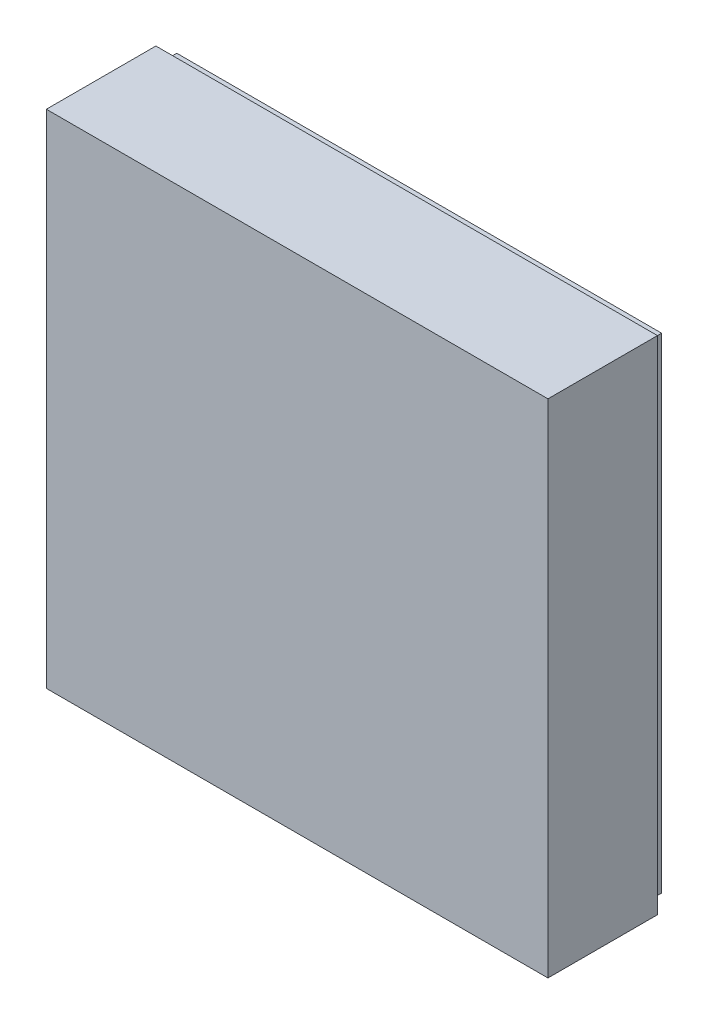
ISO-10303-21;
HEADER;
FILE_DESCRIPTION(('STEP AP214'),'2;1');
FILE_NAME('part.step','',(''),(''),'','','');
FILE_SCHEMA(('AUTOMOTIVE_DESIGN { 1 0 10303 214 1 1 1 1 }'));
ENDSEC;
DATA;
#1=APPLICATION_CONTEXT('core data for automotive mechanical design processes');
#2=APPLICATION_PROTOCOL_DEFINITION('international standard','automotive_design',2000,#1);
#3=PRODUCT_CONTEXT('',#1,'mechanical');
#4=PRODUCT('Part','Part','',(#3));
#5=PRODUCT_RELATED_PRODUCT_CATEGORY('part','',(#4));
#6=PRODUCT_DEFINITION_FORMATION('','',#4);
#7=PRODUCT_DEFINITION_CONTEXT('part definition',#1,'design');
#8=PRODUCT_DEFINITION('design','',#6,#7);
#9=PRODUCT_DEFINITION_SHAPE('','',#8);
#10=(LENGTH_UNIT() NAMED_UNIT(*) SI_UNIT(.MILLI.,.METRE.));
#11=(NAMED_UNIT(*) PLANE_ANGLE_UNIT() SI_UNIT($,.RADIAN.));
#12=(NAMED_UNIT(*) SI_UNIT($,.STERADIAN.) SOLID_ANGLE_UNIT());
#13=UNCERTAINTY_MEASURE_WITH_UNIT(LENGTH_MEASURE(1.E-05),#10,'distance_accuracy_value','');
#14=(GEOMETRIC_REPRESENTATION_CONTEXT(3) GLOBAL_UNCERTAINTY_ASSIGNED_CONTEXT((#13)) GLOBAL_UNIT_ASSIGNED_CONTEXT((#10,
#11,#12)) REPRESENTATION_CONTEXT('',''));
#15=CARTESIAN_POINT('',(0.,0.,0.));
#16=DIRECTION('',(0.,0.,1.));
#17=DIRECTION('',(1.,0.,0.));
#18=AXIS2_PLACEMENT_3D('',#15,#16,#17);
#19=CARTESIAN_POINT('',(1.75440540682,6.09062667297,6.613518376771));
#20=DIRECTION('',(0.,0.,1.));
#21=DIRECTION('',(1.,0.,0.));
#22=AXIS2_PLACEMENT_3D('',#19,#20,#21);
#23=PLANE('',#22);
#24=DIRECTION('',(0.,-1.,0.));
#25=VECTOR('',#24,1.);
#26=CARTESIAN_POINT('',(1.80440540682,6.04062667297,6.613518376771));
#27=LINE('',#26,#25);
#28=CARTESIAN_POINT('',(1.80440540682,6.04062667297,6.613518376771));
#29=VERTEX_POINT('',#28);
#30=CARTESIAN_POINT('',(1.80440540682,3.14062667297,6.613518376771));
#31=VERTEX_POINT('',#30);
#32=EDGE_CURVE('E93',#29,#31,#27,.T.);
#33=ORIENTED_EDGE('',*,*,#32,.F.);
#34=DIRECTION('',(1.,0.,0.));
#35=VECTOR('',#34,1.);
#36=CARTESIAN_POINT('',(4.70440540682,6.04062667297,6.613518376771));
#37=LINE('',#36,#35);
#38=CARTESIAN_POINT('',(4.70440540682,6.04062667297,6.613518376771));
#39=VERTEX_POINT('',#38);
#40=EDGE_CURVE('E81',#39,#29,#37,.F.);
#41=ORIENTED_EDGE('',*,*,#40,.F.);
#42=DIRECTION('',(0.,1.,0.));
#43=VECTOR('',#42,1.);
#44=CARTESIAN_POINT('',(4.70440540682,6.04062667297,6.613518376771));
#45=LINE('',#44,#43);
#46=CARTESIAN_POINT('',(4.70440540682,3.14062667297,6.613518376771));
#47=VERTEX_POINT('',#46);
#48=EDGE_CURVE('E108',#47,#39,#45,.T.);
#49=ORIENTED_EDGE('',*,*,#48,.F.);
#50=DIRECTION('',(1.,0.,0.));
#51=VECTOR('',#50,1.);
#52=CARTESIAN_POINT('',(4.70440540682,3.14062667297,6.613518376771));
#53=LINE('',#52,#51);
#54=EDGE_CURVE('E95',#31,#47,#53,.T.);
#55=ORIENTED_EDGE('',*,*,#54,.F.);
#56=EDGE_LOOP('',(#33,#41,#49,#55));
#57=FACE_BOUND('',#56,.T.);
#58=ADVANCED_FACE('F17',(#57),#23,.F.);
#59=CARTESIAN_POINT('',(1.80440540682,6.04062667297,6.688518376771));
#60=DIRECTION('',(-1.,0.,0.));
#61=DIRECTION('',(0.,-1.,0.));
#62=AXIS2_PLACEMENT_3D('',#59,#60,#61);
#63=PLANE('',#62);
#64=ORIENTED_EDGE('',*,*,#32,.T.);
#65=DIRECTION('',(0.,0.,-1.));
#66=VECTOR('',#65,1.);
#67=CARTESIAN_POINT('',(1.80440540682,3.14062667297,6.688518376771));
#68=LINE('',#67,#66);
#69=CARTESIAN_POINT('',(1.80440540682,3.14062667297,6.688518376771));
#70=VERTEX_POINT('',#69);
#71=EDGE_CURVE('E99',#70,#31,#68,.T.);
#72=ORIENTED_EDGE('',*,*,#71,.F.);
#73=DIRECTION('',(0.,1.,0.));
#74=VECTOR('',#73,1.);
#75=CARTESIAN_POINT('',(1.80440540682,6.09062667297,6.688518376771));
#76=LINE('',#75,#74);
#77=CARTESIAN_POINT('',(1.80440540682,6.04062667297,6.688518376771));
#78=VERTEX_POINT('',#77);
#79=EDGE_CURVE('E91',#78,#70,#76,.F.);
#80=ORIENTED_EDGE('',*,*,#79,.F.);
#81=DIRECTION('',(0.,0.,1.));
#82=VECTOR('',#81,1.);
#83=CARTESIAN_POINT('',(1.80440540682,6.04062667297,6.688518376771));
#84=LINE('',#83,#82);
#85=EDGE_CURVE('E86',#78,#29,#84,.F.);
#86=ORIENTED_EDGE('',*,*,#85,.T.);
#87=EDGE_LOOP('',(#64,#72,#80,#86));
#88=FACE_BOUND('',#87,.T.);
#89=ADVANCED_FACE('F102',(#88),#63,.T.);
#90=CARTESIAN_POINT('',(4.70440540682,3.14062667297,6.688518376771));
#91=DIRECTION('',(0.,-1.,0.));
#92=DIRECTION('',(0.,0.,-1.));
#93=AXIS2_PLACEMENT_3D('',#90,#91,#92);
#94=PLANE('',#93);
#95=ORIENTED_EDGE('',*,*,#54,.T.);
#96=DIRECTION('',(0.,0.,-1.));
#97=VECTOR('',#96,1.);
#98=CARTESIAN_POINT('',(4.70440540682,3.14062667297,6.688518376771));
#99=LINE('',#98,#97);
#100=CARTESIAN_POINT('',(4.70440540682,3.14062667297,6.688518376771));
#101=VERTEX_POINT('',#100);
#102=EDGE_CURVE('E110',#101,#47,#99,.T.);
#103=ORIENTED_EDGE('',*,*,#102,.F.);
#104=DIRECTION('',(-1.,0.,0.));
#105=VECTOR('',#104,1.);
#106=CARTESIAN_POINT('',(1.75440540682,3.14062667297,6.688518376771));
#107=LINE('',#106,#105);
#108=EDGE_CURVE('E125',#70,#101,#107,.F.);
#109=ORIENTED_EDGE('',*,*,#108,.F.);
#110=ORIENTED_EDGE('',*,*,#71,.T.);
#111=EDGE_LOOP('',(#95,#103,#109,#110));
#112=FACE_BOUND('',#111,.T.);
#113=ADVANCED_FACE('F123',(#112),#94,.T.);
#114=CARTESIAN_POINT('',(4.70440540682,6.04062667297,6.688518376771));
#115=DIRECTION('',(1.,0.,0.));
#116=DIRECTION('',(0.,0.,-1.));
#117=AXIS2_PLACEMENT_3D('',#114,#115,#116);
#118=PLANE('',#117);
#119=ORIENTED_EDGE('',*,*,#102,.T.);
#120=ORIENTED_EDGE('',*,*,#48,.T.);
#121=DIRECTION('',(0.,0.,1.));
#122=VECTOR('',#121,1.);
#123=CARTESIAN_POINT('',(4.70440540682,6.04062667297,6.688518376771));
#124=LINE('',#123,#122);
#125=CARTESIAN_POINT('',(4.70440540682,6.04062667297,6.688518376771));
#126=VERTEX_POINT('',#125);
#127=EDGE_CURVE('E88',#126,#39,#124,.F.);
#128=ORIENTED_EDGE('',*,*,#127,.F.);
#129=DIRECTION('',(0.,1.,0.));
#130=VECTOR('',#129,1.);
#131=CARTESIAN_POINT('',(4.70440540682,6.09062667297,6.688518376771));
#132=LINE('',#131,#130);
#133=EDGE_CURVE('E131',#101,#126,#132,.T.);
#134=ORIENTED_EDGE('',*,*,#133,.F.);
#135=EDGE_LOOP('',(#119,#120,#128,#134));
#136=FACE_BOUND('',#135,.T.);
#137=ADVANCED_FACE('F247',(#136),#118,.T.);
#138=CARTESIAN_POINT('',(4.70440540682,6.04062667297,6.688518376771));
#139=DIRECTION('',(0.,1.,0.));
#140=DIRECTION('',(0.,0.,1.));
#141=AXIS2_PLACEMENT_3D('',#138,#139,#140);
#142=PLANE('',#141);
#143=DIRECTION('',(-1.,0.,0.));
#144=VECTOR('',#143,1.);
#145=CARTESIAN_POINT('',(1.75440540682,6.04062667297,6.688518376771));
#146=LINE('',#145,#144);
#147=EDGE_CURVE('E129',#126,#78,#146,.T.);
#148=ORIENTED_EDGE('',*,*,#147,.F.);
#149=ORIENTED_EDGE('',*,*,#127,.T.);
#150=ORIENTED_EDGE('',*,*,#40,.T.);
#151=ORIENTED_EDGE('',*,*,#85,.F.);
#152=EDGE_LOOP('',(#148,#149,#150,#151));
#153=FACE_BOUND('',#152,.T.);
#154=ADVANCED_FACE('F84',(#153),#142,.T.);
#155=CARTESIAN_POINT('',(1.75440540682,6.09062667297,6.688518376771));
#156=DIRECTION('',(0.,0.,-1.));
#157=DIRECTION('',(-1.,0.,0.));
#158=AXIS2_PLACEMENT_3D('',#155,#156,#157);
#159=PLANE('',#158);
#160=ORIENTED_EDGE('',*,*,#147,.T.);
#161=ORIENTED_EDGE('',*,*,#79,.T.);
#162=ORIENTED_EDGE('',*,*,#108,.T.);
#163=ORIENTED_EDGE('',*,*,#133,.T.);
#164=EDGE_LOOP('',(#160,#161,#162,#163));
#165=FACE_BOUND('',#164,.T.);
#166=DIRECTION('',(1.,0.,0.));
#167=VECTOR('',#166,1.);
#168=CARTESIAN_POINT('',(1.75440540682,6.09062667297,6.688518376771));
#169=LINE('',#168,#167);
#170=CARTESIAN_POINT('',(1.75440540682,6.09062667297,6.688518376771));
#171=VERTEX_POINT('',#170);
#172=CARTESIAN_POINT('',(4.75440540682,6.09062667297,6.688518376771));
#173=VERTEX_POINT('',#172);
#174=EDGE_CURVE('E153',#171,#173,#169,.T.);
#175=ORIENTED_EDGE('',*,*,#174,.T.);
#176=DIRECTION('',(0.,-1.,0.));
#177=VECTOR('',#176,1.);
#178=CARTESIAN_POINT('',(4.75440540682,6.09062667297,6.688518376771));
#179=LINE('',#178,#177);
#180=CARTESIAN_POINT('',(4.75440540682,3.09062667297,6.688518376771));
#181=VERTEX_POINT('',#180);
#182=EDGE_CURVE('E146',#173,#181,#179,.T.);
#183=ORIENTED_EDGE('',*,*,#182,.T.);
#184=DIRECTION('',(1.,0.,0.));
#185=VECTOR('',#184,1.);
#186=CARTESIAN_POINT('',(1.75440540682,3.09062667297,6.688518376771));
#187=LINE('',#186,#185);
#188=CARTESIAN_POINT('',(1.75440540682,3.09062667297,6.688518376771));
#189=VERTEX_POINT('',#188);
#190=EDGE_CURVE('E141',#181,#189,#187,.F.);
#191=ORIENTED_EDGE('',*,*,#190,.T.);
#192=DIRECTION('',(0.,1.,0.));
#193=VECTOR('',#192,1.);
#194=CARTESIAN_POINT('',(1.75440540682,6.09062667297,6.688518376771));
#195=LINE('',#194,#193);
#196=EDGE_CURVE('E136',#189,#171,#195,.T.);
#197=ORIENTED_EDGE('',*,*,#196,.T.);
#198=EDGE_LOOP('',(#175,#183,#191,#197));
#199=FACE_BOUND('',#198,.T.);
#200=ADVANCED_FACE('F127',(#165,#199),#159,.T.);
#201=CARTESIAN_POINT('',(1.75440540682,6.09062667297,7.343518376771));
#202=DIRECTION('',(1.,0.,0.));
#203=DIRECTION('',(0.,1.,0.));
#204=AXIS2_PLACEMENT_3D('',#201,#202,#203);
#205=PLANE('',#204);
#206=DIRECTION('',(0.,0.,-1.));
#207=VECTOR('',#206,1.);
#208=CARTESIAN_POINT('',(1.75440540682,6.09062667297,7.343518376771));
#209=LINE('',#208,#207);
#210=CARTESIAN_POINT('',(1.75440540682,6.09062667297,7.343518376771));
#211=VERTEX_POINT('',#210);
#212=EDGE_CURVE('E150',#211,#171,#209,.T.);
#213=ORIENTED_EDGE('',*,*,#212,.T.);
#214=ORIENTED_EDGE('',*,*,#196,.F.);
#215=DIRECTION('',(0.,0.,1.));
#216=VECTOR('',#215,1.);
#217=CARTESIAN_POINT('',(1.75440540682,3.09062667297,7.343518376771));
#218=LINE('',#217,#216);
#219=CARTESIAN_POINT('',(1.75440540682,3.09062667297,7.343518376771));
#220=VERTEX_POINT('',#219);
#221=EDGE_CURVE('E139',#189,#220,#218,.T.);
#222=ORIENTED_EDGE('',*,*,#221,.T.);
#223=DIRECTION('',(0.,1.,0.));
#224=VECTOR('',#223,1.);
#225=CARTESIAN_POINT('',(1.75440540682,6.09062667297,7.343518376771));
#226=LINE('',#225,#224);
#227=EDGE_CURVE('E155',#211,#220,#226,.F.);
#228=ORIENTED_EDGE('',*,*,#227,.F.);
#229=EDGE_LOOP('',(#213,#214,#222,#228));
#230=FACE_BOUND('',#229,.T.);
#231=ADVANCED_FACE('F174',(#230),#205,.F.);
#232=CARTESIAN_POINT('',(1.75440540682,3.09062667297,7.343518376771));
#233=DIRECTION('',(0.,1.,0.));
#234=DIRECTION('',(0.,0.,1.));
#235=AXIS2_PLACEMENT_3D('',#232,#233,#234);
#236=PLANE('',#235);
#237=ORIENTED_EDGE('',*,*,#221,.F.);
#238=ORIENTED_EDGE('',*,*,#190,.F.);
#239=DIRECTION('',(0.,0.,1.));
#240=VECTOR('',#239,1.);
#241=CARTESIAN_POINT('',(4.75440540682,3.09062667297,7.343518376771));
#242=LINE('',#241,#240);
#243=CARTESIAN_POINT('',(4.75440540682,3.09062667297,7.343518376771));
#244=VERTEX_POINT('',#243);
#245=EDGE_CURVE('E144',#181,#244,#242,.T.);
#246=ORIENTED_EDGE('',*,*,#245,.T.);
#247=DIRECTION('',(1.,0.,0.));
#248=VECTOR('',#247,1.);
#249=CARTESIAN_POINT('',(1.75440540682,3.09062667297,7.343518376771));
#250=LINE('',#249,#248);
#251=EDGE_CURVE('E158',#220,#244,#250,.T.);
#252=ORIENTED_EDGE('',*,*,#251,.F.);
#253=EDGE_LOOP('',(#237,#238,#246,#252));
#254=FACE_BOUND('',#253,.T.);
#255=ADVANCED_FACE('F169',(#254),#236,.F.);
#256=CARTESIAN_POINT('',(4.75440540682,6.09062667297,7.343518376771));
#257=DIRECTION('',(-1.,0.,0.));
#258=DIRECTION('',(0.,-1.,0.));
#259=AXIS2_PLACEMENT_3D('',#256,#257,#258);
#260=PLANE('',#259);
#261=ORIENTED_EDGE('',*,*,#245,.F.);
#262=ORIENTED_EDGE('',*,*,#182,.F.);
#263=DIRECTION('',(0.,0.,-1.));
#264=VECTOR('',#263,1.);
#265=CARTESIAN_POINT('',(4.75440540682,6.09062667297,7.343518376771));
#266=LINE('',#265,#264);
#267=CARTESIAN_POINT('',(4.75440540682,6.09062667297,7.343518376771));
#268=VERTEX_POINT('',#267);
#269=EDGE_CURVE('E35',#173,#268,#266,.F.);
#270=ORIENTED_EDGE('',*,*,#269,.T.);
#271=DIRECTION('',(0.,1.,0.));
#272=VECTOR('',#271,1.);
#273=CARTESIAN_POINT('',(4.75440540682,6.09062667297,7.343518376771));
#274=LINE('',#273,#272);
#275=EDGE_CURVE('E26',#244,#268,#274,.T.);
#276=ORIENTED_EDGE('',*,*,#275,.F.);
#277=EDGE_LOOP('',(#261,#262,#270,#276));
#278=FACE_BOUND('',#277,.T.);
#279=ADVANCED_FACE('F166',(#278),#260,.F.);
#280=CARTESIAN_POINT('',(1.75440540682,6.09062667297,7.343518376771));
#281=DIRECTION('',(0.,-1.,0.));
#282=DIRECTION('',(0.,0.,-1.));
#283=AXIS2_PLACEMENT_3D('',#280,#281,#282);
#284=PLANE('',#283);
#285=ORIENTED_EDGE('',*,*,#269,.F.);
#286=ORIENTED_EDGE('',*,*,#174,.F.);
#287=ORIENTED_EDGE('',*,*,#212,.F.);
#288=DIRECTION('',(1.,0.,0.));
#289=VECTOR('',#288,1.);
#290=CARTESIAN_POINT('',(1.75440540682,6.09062667297,7.343518376771));
#291=LINE('',#290,#289);
#292=EDGE_CURVE('E11',#268,#211,#291,.F.);
#293=ORIENTED_EDGE('',*,*,#292,.F.);
#294=EDGE_LOOP('',(#285,#286,#287,#293));
#295=FACE_BOUND('',#294,.T.);
#296=ADVANCED_FACE('F172',(#295),#284,.F.);
#297=CARTESIAN_POINT('',(1.75440540682,6.09062667297,7.343518376771));
#298=DIRECTION('',(0.,0.,1.));
#299=DIRECTION('',(1.,0.,0.));
#300=AXIS2_PLACEMENT_3D('',#297,#298,#299);
#301=PLANE('',#300);
#302=ORIENTED_EDGE('',*,*,#275,.T.);
#303=ORIENTED_EDGE('',*,*,#292,.T.);
#304=ORIENTED_EDGE('',*,*,#227,.T.);
#305=ORIENTED_EDGE('',*,*,#251,.T.);
#306=EDGE_LOOP('',(#302,#303,#304,#305));
#307=FACE_BOUND('',#306,.T.);
#308=ADVANCED_FACE('F163',(#307),#301,.T.);
#309=CLOSED_SHELL('',(#58,#89,#113,#137,#154,#200,#231,#255,#279,#296,#308));
#310=MANIFOLD_SOLID_BREP('B1',#309);
#311=ADVANCED_BREP_SHAPE_REPRESENTATION('',(#18,#310),#14);
#312=SHAPE_DEFINITION_REPRESENTATION(#9,#311);
ENDSEC;
END-ISO-10303-21;
